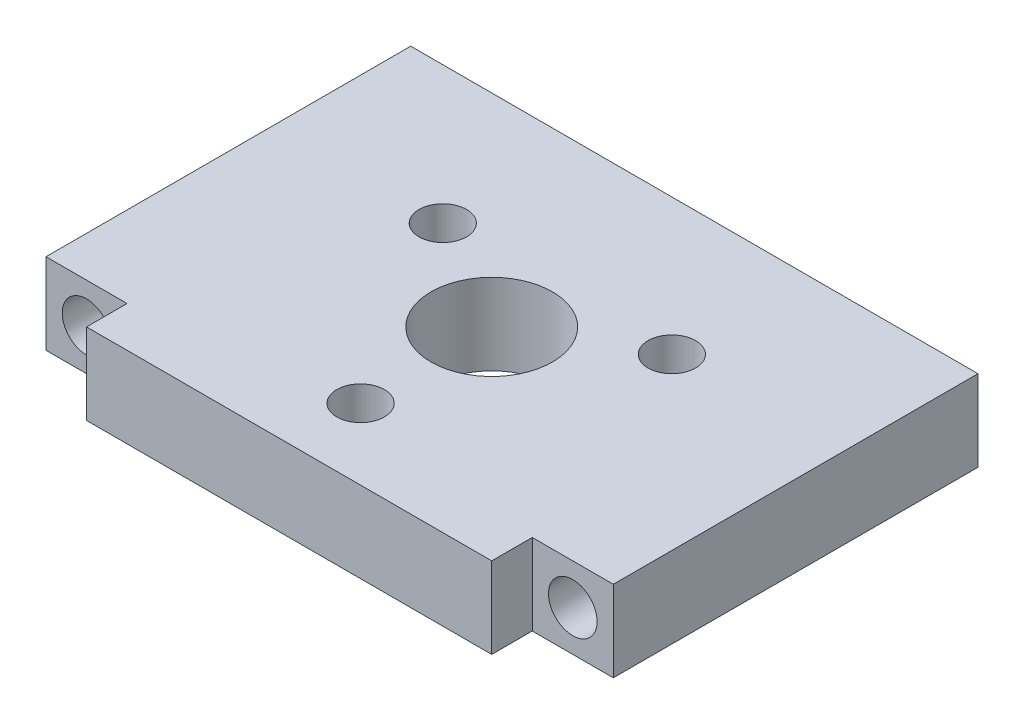
ISO-10303-21;
HEADER;
FILE_DESCRIPTION(('STEP AP214'),'2;1');
FILE_NAME('part.step','',(''),(''),'','','');
FILE_SCHEMA(('AUTOMOTIVE_DESIGN { 1 0 10303 214 1 1 1 1 }'));
ENDSEC;
DATA;
#1=APPLICATION_CONTEXT('core data for automotive mechanical design processes');
#2=APPLICATION_PROTOCOL_DEFINITION('international standard','automotive_design',2000,#1);
#3=PRODUCT_CONTEXT('',#1,'mechanical');
#4=PRODUCT('Part','Part','',(#3));
#5=PRODUCT_RELATED_PRODUCT_CATEGORY('part','',(#4));
#6=PRODUCT_DEFINITION_FORMATION('','',#4);
#7=PRODUCT_DEFINITION_CONTEXT('part definition',#1,'design');
#8=PRODUCT_DEFINITION('design','',#6,#7);
#9=PRODUCT_DEFINITION_SHAPE('','',#8);
#10=(LENGTH_UNIT() NAMED_UNIT(*) SI_UNIT(.MILLI.,.METRE.));
#11=(NAMED_UNIT(*) PLANE_ANGLE_UNIT() SI_UNIT($,.RADIAN.));
#12=(NAMED_UNIT(*) SI_UNIT($,.STERADIAN.) SOLID_ANGLE_UNIT());
#13=UNCERTAINTY_MEASURE_WITH_UNIT(LENGTH_MEASURE(1.E-05),#10,'distance_accuracy_value','');
#14=(GEOMETRIC_REPRESENTATION_CONTEXT(3) GLOBAL_UNCERTAINTY_ASSIGNED_CONTEXT((#13)) GLOBAL_UNIT_ASSIGNED_CONTEXT((#10,
#11,#12)) REPRESENTATION_CONTEXT('',''));
#15=CARTESIAN_POINT('',(0.,0.,0.));
#16=DIRECTION('',(0.,0.,1.));
#17=DIRECTION('',(1.,0.,0.));
#18=AXIS2_PLACEMENT_3D('',#15,#16,#17);
#19=CARTESIAN_POINT('',(28.,0.,20.));
#20=DIRECTION('',(-1.,0.,0.));
#21=DIRECTION('',(0.,0.,1.));
#22=AXIS2_PLACEMENT_3D('',#19,#20,#21);
#23=PLANE('',#22);
#24=DIRECTION('',(0.,1.,0.));
#25=VECTOR('',#24,1.);
#26=CARTESIAN_POINT('',(28.,0.,18.));
#27=LINE('',#26,#25);
#28=CARTESIAN_POINT('',(28.,0.,18.));
#29=VERTEX_POINT('',#28);
#30=CARTESIAN_POINT('',(28.,4.,18.));
#31=VERTEX_POINT('',#30);
#32=EDGE_CURVE('E100',#29,#31,#27,.T.);
#33=ORIENTED_EDGE('',*,*,#32,.F.);
#34=DIRECTION('',(0.,0.,-1.));
#35=VECTOR('',#34,1.);
#36=CARTESIAN_POINT('',(28.,0.,20.));
#37=LINE('',#36,#35);
#38=CARTESIAN_POINT('',(28.,0.,0.));
#39=VERTEX_POINT('',#38);
#40=EDGE_CURVE('E42',#29,#39,#37,.T.);
#41=ORIENTED_EDGE('',*,*,#40,.T.);
#42=DIRECTION('',(0.,1.,0.));
#43=VECTOR('',#42,1.);
#44=CARTESIAN_POINT('',(28.,0.,0.));
#45=LINE('',#44,#43);
#46=CARTESIAN_POINT('',(28.,4.,0.));
#47=VERTEX_POINT('',#46);
#48=EDGE_CURVE('E122',#39,#47,#45,.T.);
#49=ORIENTED_EDGE('',*,*,#48,.T.);
#50=DIRECTION('',(0.,0.,-1.));
#51=VECTOR('',#50,1.);
#52=CARTESIAN_POINT('',(28.,4.,20.));
#53=LINE('',#52,#51);
#54=EDGE_CURVE('E117',#31,#47,#53,.T.);
#55=ORIENTED_EDGE('',*,*,#54,.F.);
#56=EDGE_LOOP('',(#33,#41,#49,#55));
#57=FACE_BOUND('',#56,.T.);
#58=ADVANCED_FACE('F33',(#57),#23,.F.);
#59=CARTESIAN_POINT('',(26.,2.00000000000002,0.));
#60=DIRECTION('',(0.,0.,1.));
#61=DIRECTION('',(1.,0.,0.));
#62=AXIS2_PLACEMENT_3D('',#59,#60,#61);
#63=CYLINDRICAL_SURFACE('',#62,1.2);
#64=CARTESIAN_POINT('',(26.,2.00000000000002,0.));
#65=DIRECTION('',(0.,0.,1.));
#66=DIRECTION('',(1.,0.,0.));
#67=AXIS2_PLACEMENT_3D('',#64,#65,#66);
#68=CIRCLE('',#67,1.2);
#69=CARTESIAN_POINT('',(27.2,2.00000000000002,0.));
#70=VERTEX_POINT('',#69);
#71=EDGE_CURVE('E166',#70,#70,#68,.T.);
#72=ORIENTED_EDGE('',*,*,#71,.F.);
#73=EDGE_LOOP('',(#72));
#74=FACE_BOUND('',#73,.T.);
#75=CARTESIAN_POINT('',(26.,2.00000000000002,18.));
#76=DIRECTION('',(0.,0.,1.));
#77=DIRECTION('',(1.,0.,0.));
#78=AXIS2_PLACEMENT_3D('',#75,#76,#77);
#79=CIRCLE('',#78,1.2);
#80=CARTESIAN_POINT('',(27.2,2.00000000000002,18.));
#81=VERTEX_POINT('',#80);
#82=EDGE_CURVE('E37',#81,#81,#79,.F.);
#83=ORIENTED_EDGE('',*,*,#82,.F.);
#84=EDGE_LOOP('',(#83));
#85=FACE_BOUND('',#84,.T.);
#86=ADVANCED_FACE('F227',(#74,#85),#63,.F.);
#87=CARTESIAN_POINT('',(0.,0.,20.));
#88=DIRECTION('',(1.,0.,0.));
#89=DIRECTION('',(0.,0.,-1.));
#90=AXIS2_PLACEMENT_3D('',#87,#88,#89);
#91=PLANE('',#90);
#92=DIRECTION('',(0.,-1.,0.));
#93=VECTOR('',#92,1.);
#94=CARTESIAN_POINT('',(0.,4.,18.));
#95=LINE('',#94,#93);
#96=CARTESIAN_POINT('',(0.,4.,18.));
#97=VERTEX_POINT('',#96);
#98=CARTESIAN_POINT('',(0.,0.,18.));
#99=VERTEX_POINT('',#98);
#100=EDGE_CURVE('E193',#97,#99,#95,.T.);
#101=ORIENTED_EDGE('',*,*,#100,.F.);
#102=DIRECTION('',(0.,0.,-1.));
#103=VECTOR('',#102,1.);
#104=CARTESIAN_POINT('',(0.,4.,20.));
#105=LINE('',#104,#103);
#106=CARTESIAN_POINT('',(0.,4.,0.));
#107=VERTEX_POINT('',#106);
#108=EDGE_CURVE('E124',#97,#107,#105,.T.);
#109=ORIENTED_EDGE('',*,*,#108,.T.);
#110=DIRECTION('',(0.,-1.,0.));
#111=VECTOR('',#110,1.);
#112=CARTESIAN_POINT('',(0.,0.,0.));
#113=LINE('',#112,#111);
#114=CARTESIAN_POINT('',(0.,0.,0.));
#115=VERTEX_POINT('',#114);
#116=EDGE_CURVE('E174',#107,#115,#113,.T.);
#117=ORIENTED_EDGE('',*,*,#116,.T.);
#118=DIRECTION('',(0.,0.,-1.));
#119=VECTOR('',#118,1.);
#120=CARTESIAN_POINT('',(0.,0.,20.));
#121=LINE('',#120,#119);
#122=EDGE_CURVE('E11',#99,#115,#121,.T.);
#123=ORIENTED_EDGE('',*,*,#122,.F.);
#124=EDGE_LOOP('',(#101,#109,#117,#123));
#125=FACE_BOUND('',#124,.T.);
#126=ADVANCED_FACE('F35',(#125),#91,.F.);
#127=CARTESIAN_POINT('',(2.,2.,0.));
#128=DIRECTION('',(0.,0.,1.));
#129=DIRECTION('',(1.,0.,0.));
#130=AXIS2_PLACEMENT_3D('',#127,#128,#129);
#131=CYLINDRICAL_SURFACE('',#130,1.2);
#132=CARTESIAN_POINT('',(2.,2.,0.));
#133=DIRECTION('',(0.,0.,1.));
#134=DIRECTION('',(1.,0.,0.));
#135=AXIS2_PLACEMENT_3D('',#132,#133,#134);
#136=CIRCLE('',#135,1.2);
#137=CARTESIAN_POINT('',(3.2,2.,0.));
#138=VERTEX_POINT('',#137);
#139=EDGE_CURVE('E171',#138,#138,#136,.T.);
#140=ORIENTED_EDGE('',*,*,#139,.F.);
#141=EDGE_LOOP('',(#140));
#142=FACE_BOUND('',#141,.T.);
#143=CARTESIAN_POINT('',(2.,2.,18.));
#144=DIRECTION('',(0.,0.,1.));
#145=DIRECTION('',(1.,0.,0.));
#146=AXIS2_PLACEMENT_3D('',#143,#144,#145);
#147=CIRCLE('',#146,1.2);
#148=CARTESIAN_POINT('',(3.2,2.,18.));
#149=VERTEX_POINT('',#148);
#150=EDGE_CURVE('E130',#149,#149,#147,.F.);
#151=ORIENTED_EDGE('',*,*,#150,.F.);
#152=EDGE_LOOP('',(#151));
#153=FACE_BOUND('',#152,.T.);
#154=ADVANCED_FACE('F238',(#142,#153),#131,.F.);
#155=CARTESIAN_POINT('',(0.,0.,20.));
#156=DIRECTION('',(0.,1.,0.));
#157=DIRECTION('',(0.,0.,1.));
#158=AXIS2_PLACEMENT_3D('',#155,#156,#157);
#159=PLANE('',#158);
#160=CARTESIAN_POINT('',(8.35754662041777,0.,6.77312537286602));
#161=DIRECTION('',(0.,1.,0.));
#162=DIRECTION('',(0.,0.,1.));
#163=AXIS2_PLACEMENT_3D('',#160,#161,#162);
#164=CIRCLE('',#163,1.17364489698971);
#165=CARTESIAN_POINT('',(8.35754662041777,0.,7.94677026985572));
#166=VERTEX_POINT('',#165);
#167=EDGE_CURVE('E148',#166,#166,#164,.T.);
#168=ORIENTED_EDGE('',*,*,#167,.T.);
#169=EDGE_LOOP('',(#168));
#170=FACE_BOUND('',#169,.T.);
#171=CARTESIAN_POINT('',(19.6157820917166,0.,6.72692934717941));
#172=DIRECTION('',(0.,1.,0.));
#173=DIRECTION('',(0.,0.,1.));
#174=AXIS2_PLACEMENT_3D('',#171,#172,#173);
#175=CIRCLE('',#174,1.1736448969897);
#176=CARTESIAN_POINT('',(19.6157820917166,0.,7.90057424416912));
#177=VERTEX_POINT('',#176);
#178=EDGE_CURVE('E155',#177,#177,#175,.T.);
#179=ORIENTED_EDGE('',*,*,#178,.T.);
#180=EDGE_LOOP('',(#179));
#181=FACE_BOUND('',#180,.T.);
#182=CARTESIAN_POINT('',(14.0266712878657,0.,16.4999452799546));
#183=DIRECTION('',(0.,1.,0.));
#184=DIRECTION('',(0.,0.,1.));
#185=AXIS2_PLACEMENT_3D('',#182,#183,#184);
#186=CIRCLE('',#185,1.1736448969897);
#187=CARTESIAN_POINT('',(14.0266712878657,0.,17.6735901769443));
#188=VERTEX_POINT('',#187);
#189=EDGE_CURVE('E137',#188,#188,#186,.T.);
#190=ORIENTED_EDGE('',*,*,#189,.T.);
#191=EDGE_LOOP('',(#190));
#192=FACE_BOUND('',#191,.T.);
#193=CARTESIAN_POINT('',(14.,0.,10.));
#194=DIRECTION('',(0.,1.,0.));
#195=DIRECTION('',(0.,0.,1.));
#196=AXIS2_PLACEMENT_3D('',#193,#194,#195);
#197=CIRCLE('',#196,3.);
#198=CARTESIAN_POINT('',(14.,0.,13.));
#199=VERTEX_POINT('',#198);
#200=EDGE_CURVE('E163',#199,#199,#197,.T.);
#201=ORIENTED_EDGE('',*,*,#200,.T.);
#202=EDGE_LOOP('',(#201));
#203=FACE_BOUND('',#202,.T.);
#204=DIRECTION('',(1.,0.,0.));
#205=VECTOR('',#204,1.);
#206=CARTESIAN_POINT('',(28.,0.,18.));
#207=LINE('',#206,#205);
#208=CARTESIAN_POINT('',(24.,0.,18.));
#209=VERTEX_POINT('',#208);
#210=EDGE_CURVE('E107',#209,#29,#207,.T.);
#211=ORIENTED_EDGE('',*,*,#210,.F.);
#212=DIRECTION('',(0.,0.,1.));
#213=VECTOR('',#212,1.);
#214=CARTESIAN_POINT('',(24.,0.,18.));
#215=LINE('',#214,#213);
#216=CARTESIAN_POINT('',(24.,0.,20.));
#217=VERTEX_POINT('',#216);
#218=EDGE_CURVE('E213',#209,#217,#215,.T.);
#219=ORIENTED_EDGE('',*,*,#218,.T.);
#220=DIRECTION('',(1.,0.,0.));
#221=VECTOR('',#220,1.);
#222=CARTESIAN_POINT('',(0.,0.,20.));
#223=LINE('',#222,#221);
#224=CARTESIAN_POINT('',(4.,0.,20.));
#225=VERTEX_POINT('',#224);
#226=EDGE_CURVE('E175',#225,#217,#223,.T.);
#227=ORIENTED_EDGE('',*,*,#226,.F.);
#228=DIRECTION('',(0.,0.,1.));
#229=VECTOR('',#228,1.);
#230=CARTESIAN_POINT('',(4.,0.,18.));
#231=LINE('',#230,#229);
#232=CARTESIAN_POINT('',(4.,0.,18.));
#233=VERTEX_POINT('',#232);
#234=EDGE_CURVE('E58',#233,#225,#231,.T.);
#235=ORIENTED_EDGE('',*,*,#234,.F.);
#236=DIRECTION('',(1.,0.,0.));
#237=VECTOR('',#236,1.);
#238=CARTESIAN_POINT('',(0.,0.,18.));
#239=LINE('',#238,#237);
#240=EDGE_CURVE('E197',#99,#233,#239,.T.);
#241=ORIENTED_EDGE('',*,*,#240,.F.);
#242=ORIENTED_EDGE('',*,*,#122,.T.);
#243=DIRECTION('',(1.,0.,0.));
#244=VECTOR('',#243,1.);
#245=CARTESIAN_POINT('',(0.,0.,0.));
#246=LINE('',#245,#244);
#247=EDGE_CURVE('E182',#115,#39,#246,.T.);
#248=ORIENTED_EDGE('',*,*,#247,.T.);
#249=ORIENTED_EDGE('',*,*,#40,.F.);
#250=EDGE_LOOP('',(#211,#219,#227,#235,#241,#242,#248,#249));
#251=FACE_BOUND('',#250,.T.);
#252=ADVANCED_FACE('F212',(#170,#181,#192,#203,#251),#159,.F.);
#253=CARTESIAN_POINT('',(0.,4.,20.));
#254=DIRECTION('',(0.,-1.,0.));
#255=DIRECTION('',(0.,0.,-1.));
#256=AXIS2_PLACEMENT_3D('',#253,#254,#255);
#257=PLANE('',#256);
#258=CARTESIAN_POINT('',(8.35754662041777,4.,6.77312537286602));
#259=DIRECTION('',(0.,1.,0.));
#260=DIRECTION('',(0.,0.,1.));
#261=AXIS2_PLACEMENT_3D('',#258,#259,#260);
#262=CIRCLE('',#261,1.17364489698971);
#263=CARTESIAN_POINT('',(8.35754662041777,4.,7.94677026985572));
#264=VERTEX_POINT('',#263);
#265=EDGE_CURVE('E152',#264,#264,#262,.T.);
#266=ORIENTED_EDGE('',*,*,#265,.F.);
#267=EDGE_LOOP('',(#266));
#268=FACE_BOUND('',#267,.T.);
#269=CARTESIAN_POINT('',(19.6157820917166,4.,6.72692934717941));
#270=DIRECTION('',(0.,1.,0.));
#271=DIRECTION('',(0.,0.,1.));
#272=AXIS2_PLACEMENT_3D('',#269,#270,#271);
#273=CIRCLE('',#272,1.1736448969897);
#274=CARTESIAN_POINT('',(19.6157820917166,4.,7.90057424416912));
#275=VERTEX_POINT('',#274);
#276=EDGE_CURVE('E158',#275,#275,#273,.T.);
#277=ORIENTED_EDGE('',*,*,#276,.F.);
#278=EDGE_LOOP('',(#277));
#279=FACE_BOUND('',#278,.T.);
#280=CARTESIAN_POINT('',(14.0266712878657,4.,16.4999452799546));
#281=DIRECTION('',(0.,1.,0.));
#282=DIRECTION('',(0.,0.,1.));
#283=AXIS2_PLACEMENT_3D('',#280,#281,#282);
#284=CIRCLE('',#283,1.1736448969897);
#285=CARTESIAN_POINT('',(14.0266712878657,4.,17.6735901769443));
#286=VERTEX_POINT('',#285);
#287=EDGE_CURVE('E132',#286,#286,#284,.T.);
#288=ORIENTED_EDGE('',*,*,#287,.F.);
#289=EDGE_LOOP('',(#288));
#290=FACE_BOUND('',#289,.T.);
#291=CARTESIAN_POINT('',(14.,4.,10.));
#292=DIRECTION('',(0.,1.,0.));
#293=DIRECTION('',(0.,0.,1.));
#294=AXIS2_PLACEMENT_3D('',#291,#292,#293);
#295=CIRCLE('',#294,3.);
#296=CARTESIAN_POINT('',(14.,4.,13.));
#297=VERTEX_POINT('',#296);
#298=EDGE_CURVE('E151',#297,#297,#295,.T.);
#299=ORIENTED_EDGE('',*,*,#298,.F.);
#300=EDGE_LOOP('',(#299));
#301=FACE_BOUND('',#300,.T.);
#302=DIRECTION('',(-1.,0.,0.));
#303=VECTOR('',#302,1.);
#304=CARTESIAN_POINT('',(0.,4.,20.));
#305=LINE('',#304,#303);
#306=CARTESIAN_POINT('',(24.,4.,20.));
#307=VERTEX_POINT('',#306);
#308=CARTESIAN_POINT('',(4.,4.,20.));
#309=VERTEX_POINT('',#308);
#310=EDGE_CURVE('E127',#307,#309,#305,.T.);
#311=ORIENTED_EDGE('',*,*,#310,.F.);
#312=DIRECTION('',(0.,0.,1.));
#313=VECTOR('',#312,1.);
#314=CARTESIAN_POINT('',(24.,4.,18.));
#315=LINE('',#314,#313);
#316=CARTESIAN_POINT('',(24.,4.,18.));
#317=VERTEX_POINT('',#316);
#318=EDGE_CURVE('E50',#317,#307,#315,.T.);
#319=ORIENTED_EDGE('',*,*,#318,.F.);
#320=DIRECTION('',(-1.,0.,0.));
#321=VECTOR('',#320,1.);
#322=CARTESIAN_POINT('',(28.,4.,18.));
#323=LINE('',#322,#321);
#324=EDGE_CURVE('E105',#31,#317,#323,.T.);
#325=ORIENTED_EDGE('',*,*,#324,.F.);
#326=ORIENTED_EDGE('',*,*,#54,.T.);
#327=DIRECTION('',(-1.,0.,0.));
#328=VECTOR('',#327,1.);
#329=CARTESIAN_POINT('',(0.,4.,0.));
#330=LINE('',#329,#328);
#331=EDGE_CURVE('E178',#47,#107,#330,.T.);
#332=ORIENTED_EDGE('',*,*,#331,.T.);
#333=ORIENTED_EDGE('',*,*,#108,.F.);
#334=DIRECTION('',(-1.,0.,0.));
#335=VECTOR('',#334,1.);
#336=CARTESIAN_POINT('',(0.,4.,18.));
#337=LINE('',#336,#335);
#338=CARTESIAN_POINT('',(4.,4.,18.));
#339=VERTEX_POINT('',#338);
#340=EDGE_CURVE('E142',#339,#97,#337,.T.);
#341=ORIENTED_EDGE('',*,*,#340,.F.);
#342=DIRECTION('',(0.,0.,1.));
#343=VECTOR('',#342,1.);
#344=CARTESIAN_POINT('',(4.,4.,18.));
#345=LINE('',#344,#343);
#346=EDGE_CURVE('E133',#339,#309,#345,.T.);
#347=ORIENTED_EDGE('',*,*,#346,.T.);
#348=EDGE_LOOP('',(#311,#319,#325,#326,#332,#333,#341,#347));
#349=FACE_BOUND('',#348,.T.);
#350=ADVANCED_FACE('F115',(#268,#279,#290,#301,#349),#257,.F.);
#351=CARTESIAN_POINT('',(0.,0.,20.));
#352=DIRECTION('',(0.,0.,-1.));
#353=DIRECTION('',(-1.,0.,0.));
#354=AXIS2_PLACEMENT_3D('',#351,#352,#353);
#355=PLANE('',#354);
#356=ORIENTED_EDGE('',*,*,#226,.T.);
#357=DIRECTION('',(0.,-1.,0.));
#358=VECTOR('',#357,1.);
#359=CARTESIAN_POINT('',(24.,0.,20.));
#360=LINE('',#359,#358);
#361=EDGE_CURVE('E111',#307,#217,#360,.T.);
#362=ORIENTED_EDGE('',*,*,#361,.F.);
#363=ORIENTED_EDGE('',*,*,#310,.T.);
#364=DIRECTION('',(0.,1.,0.));
#365=VECTOR('',#364,1.);
#366=CARTESIAN_POINT('',(4.,4.,20.));
#367=LINE('',#366,#365);
#368=EDGE_CURVE('E145',#225,#309,#367,.T.);
#369=ORIENTED_EDGE('',*,*,#368,.F.);
#370=EDGE_LOOP('',(#356,#362,#363,#369));
#371=FACE_BOUND('',#370,.T.);
#372=ADVANCED_FACE('F209',(#371),#355,.F.);
#373=CARTESIAN_POINT('',(0.,0.,0.));
#374=DIRECTION('',(0.,0.,-1.));
#375=DIRECTION('',(-1.,0.,0.));
#376=AXIS2_PLACEMENT_3D('',#373,#374,#375);
#377=PLANE('',#376);
#378=ORIENTED_EDGE('',*,*,#71,.T.);
#379=EDGE_LOOP('',(#378));
#380=FACE_BOUND('',#379,.T.);
#381=ORIENTED_EDGE('',*,*,#139,.T.);
#382=EDGE_LOOP('',(#381));
#383=FACE_BOUND('',#382,.T.);
#384=ORIENTED_EDGE('',*,*,#116,.F.);
#385=ORIENTED_EDGE('',*,*,#331,.F.);
#386=ORIENTED_EDGE('',*,*,#48,.F.);
#387=ORIENTED_EDGE('',*,*,#247,.F.);
#388=EDGE_LOOP('',(#384,#385,#386,#387));
#389=FACE_BOUND('',#388,.T.);
#390=ADVANCED_FACE('F189',(#380,#383,#389),#377,.T.);
#391=CARTESIAN_POINT('',(14.,0.,10.));
#392=DIRECTION('',(0.,1.,0.));
#393=DIRECTION('',(0.,0.,1.));
#394=AXIS2_PLACEMENT_3D('',#391,#392,#393);
#395=CYLINDRICAL_SURFACE('',#394,3.);
#396=ORIENTED_EDGE('',*,*,#200,.F.);
#397=EDGE_LOOP('',(#396));
#398=FACE_BOUND('',#397,.T.);
#399=ORIENTED_EDGE('',*,*,#298,.T.);
#400=EDGE_LOOP('',(#399));
#401=FACE_BOUND('',#400,.T.);
#402=ADVANCED_FACE('F255',(#398,#401),#395,.F.);
#403=CARTESIAN_POINT('',(14.0266712878657,0.,16.4999452799546));
#404=DIRECTION('',(0.,1.,0.));
#405=DIRECTION('',(0.,0.,1.));
#406=AXIS2_PLACEMENT_3D('',#403,#404,#405);
#407=CYLINDRICAL_SURFACE('',#406,1.1736448969897);
#408=ORIENTED_EDGE('',*,*,#189,.F.);
#409=EDGE_LOOP('',(#408));
#410=FACE_BOUND('',#409,.T.);
#411=ORIENTED_EDGE('',*,*,#287,.T.);
#412=EDGE_LOOP('',(#411));
#413=FACE_BOUND('',#412,.T.);
#414=ADVANCED_FACE('F258',(#410,#413),#407,.F.);
#415=CARTESIAN_POINT('',(19.6157820917166,0.,6.72692934717941));
#416=DIRECTION('',(0.,1.,0.));
#417=DIRECTION('',(0.,0.,1.));
#418=AXIS2_PLACEMENT_3D('',#415,#416,#417);
#419=CYLINDRICAL_SURFACE('',#418,1.1736448969897);
#420=ORIENTED_EDGE('',*,*,#178,.F.);
#421=EDGE_LOOP('',(#420));
#422=FACE_BOUND('',#421,.T.);
#423=ORIENTED_EDGE('',*,*,#276,.T.);
#424=EDGE_LOOP('',(#423));
#425=FACE_BOUND('',#424,.T.);
#426=ADVANCED_FACE('F266',(#422,#425),#419,.F.);
#427=CARTESIAN_POINT('',(8.35754662041777,0.,6.77312537286602));
#428=DIRECTION('',(0.,1.,0.));
#429=DIRECTION('',(0.,0.,1.));
#430=AXIS2_PLACEMENT_3D('',#427,#428,#429);
#431=CYLINDRICAL_SURFACE('',#430,1.17364489698971);
#432=ORIENTED_EDGE('',*,*,#167,.F.);
#433=EDGE_LOOP('',(#432));
#434=FACE_BOUND('',#433,.T.);
#435=ORIENTED_EDGE('',*,*,#265,.T.);
#436=EDGE_LOOP('',(#435));
#437=FACE_BOUND('',#436,.T.);
#438=ADVANCED_FACE('F285',(#434,#437),#431,.F.);
#439=CARTESIAN_POINT('',(0.,0.,18.));
#440=DIRECTION('',(0.,0.,1.));
#441=DIRECTION('',(1.,0.,0.));
#442=AXIS2_PLACEMENT_3D('',#439,#440,#441);
#443=PLANE('',#442);
#444=ORIENTED_EDGE('',*,*,#100,.T.);
#445=ORIENTED_EDGE('',*,*,#240,.T.);
#446=DIRECTION('',(0.,1.,0.));
#447=VECTOR('',#446,1.);
#448=CARTESIAN_POINT('',(4.,4.,18.));
#449=LINE('',#448,#447);
#450=EDGE_CURVE('E199',#233,#339,#449,.T.);
#451=ORIENTED_EDGE('',*,*,#450,.T.);
#452=ORIENTED_EDGE('',*,*,#340,.T.);
#453=EDGE_LOOP('',(#444,#445,#451,#452));
#454=FACE_BOUND('',#453,.T.);
#455=ORIENTED_EDGE('',*,*,#150,.T.);
#456=EDGE_LOOP('',(#455));
#457=FACE_BOUND('',#456,.T.);
#458=ADVANCED_FACE('F205',(#454,#457),#443,.T.);
#459=CARTESIAN_POINT('',(4.,4.,18.));
#460=DIRECTION('',(1.,0.,0.));
#461=DIRECTION('',(0.,1.,0.));
#462=AXIS2_PLACEMENT_3D('',#459,#460,#461);
#463=PLANE('',#462);
#464=ORIENTED_EDGE('',*,*,#368,.T.);
#465=ORIENTED_EDGE('',*,*,#346,.F.);
#466=ORIENTED_EDGE('',*,*,#450,.F.);
#467=ORIENTED_EDGE('',*,*,#234,.T.);
#468=EDGE_LOOP('',(#464,#465,#466,#467));
#469=FACE_BOUND('',#468,.T.);
#470=ADVANCED_FACE('F206',(#469),#463,.F.);
#471=CARTESIAN_POINT('',(0.,0.,18.));
#472=DIRECTION('',(0.,0.,1.));
#473=DIRECTION('',(1.,0.,0.));
#474=AXIS2_PLACEMENT_3D('',#471,#472,#473);
#475=PLANE('',#474);
#476=ORIENTED_EDGE('',*,*,#32,.T.);
#477=ORIENTED_EDGE('',*,*,#324,.T.);
#478=DIRECTION('',(0.,-1.,0.));
#479=VECTOR('',#478,1.);
#480=CARTESIAN_POINT('',(24.,0.,18.));
#481=LINE('',#480,#479);
#482=EDGE_CURVE('E119',#317,#209,#481,.T.);
#483=ORIENTED_EDGE('',*,*,#482,.T.);
#484=ORIENTED_EDGE('',*,*,#210,.T.);
#485=EDGE_LOOP('',(#476,#477,#483,#484));
#486=FACE_BOUND('',#485,.T.);
#487=ORIENTED_EDGE('',*,*,#82,.T.);
#488=EDGE_LOOP('',(#487));
#489=FACE_BOUND('',#488,.T.);
#490=ADVANCED_FACE('F102',(#486,#489),#475,.T.);
#491=CARTESIAN_POINT('',(24.,0.,18.));
#492=DIRECTION('',(-1.,0.,0.));
#493=DIRECTION('',(0.,0.,1.));
#494=AXIS2_PLACEMENT_3D('',#491,#492,#493);
#495=PLANE('',#494);
#496=ORIENTED_EDGE('',*,*,#361,.T.);
#497=ORIENTED_EDGE('',*,*,#218,.F.);
#498=ORIENTED_EDGE('',*,*,#482,.F.);
#499=ORIENTED_EDGE('',*,*,#318,.T.);
#500=EDGE_LOOP('',(#496,#497,#498,#499));
#501=FACE_BOUND('',#500,.T.);
#502=ADVANCED_FACE('F218',(#501),#495,.F.);
#503=CLOSED_SHELL('',(#58,#86,#126,#154,#252,#350,#372,#390,#402,#414,#426,#438,#458,#470,#490,#502));
#504=MANIFOLD_SOLID_BREP('B2',#503);
#505=ADVANCED_BREP_SHAPE_REPRESENTATION('',(#18,#504),#14);
#506=SHAPE_DEFINITION_REPRESENTATION(#9,#505);
ENDSEC;
END-ISO-10303-21;
